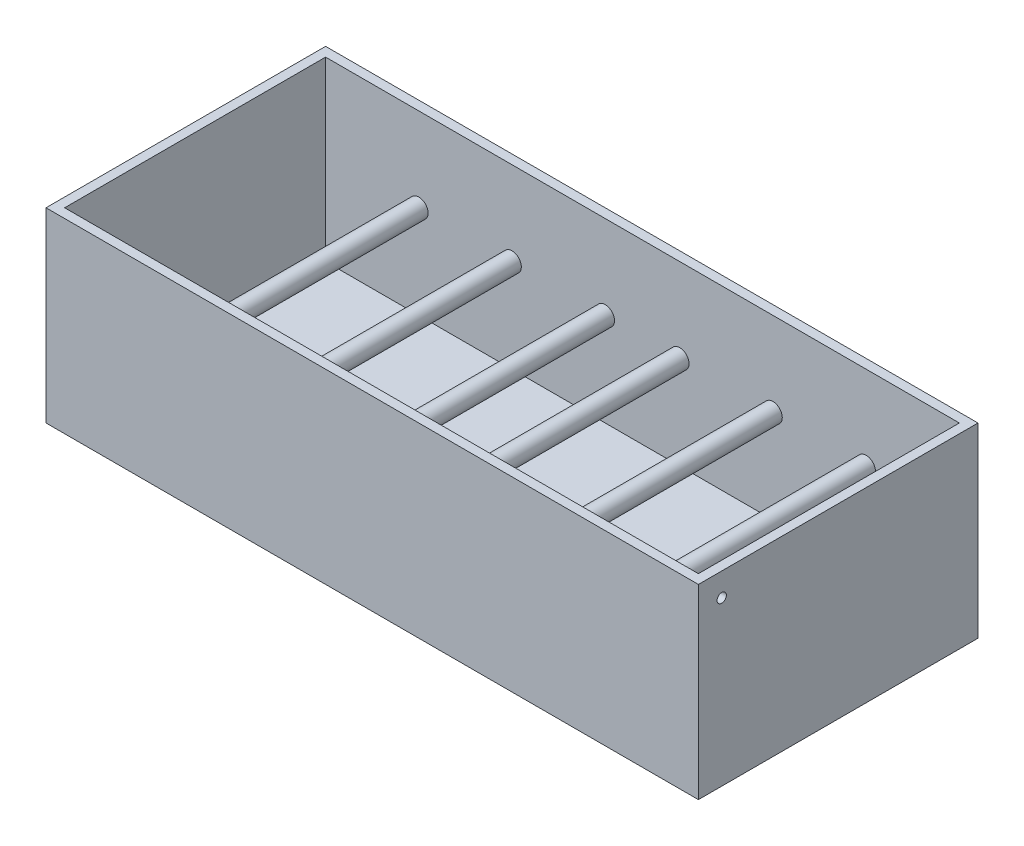
ISO-10303-21;
HEADER;
FILE_DESCRIPTION(('STEP AP214'),'2;1');
FILE_NAME('part.step','',(''),(''),'','','');
FILE_SCHEMA(('AUTOMOTIVE_DESIGN { 1 0 10303 214 1 1 1 1 }'));
ENDSEC;
DATA;
#1=APPLICATION_CONTEXT('core data for automotive mechanical design processes');
#2=APPLICATION_PROTOCOL_DEFINITION('international standard','automotive_design',2000,#1);
#3=PRODUCT_CONTEXT('',#1,'mechanical');
#4=PRODUCT('Part','Part','',(#3));
#5=PRODUCT_RELATED_PRODUCT_CATEGORY('part','',(#4));
#6=PRODUCT_DEFINITION_FORMATION('','',#4);
#7=PRODUCT_DEFINITION_CONTEXT('part definition',#1,'design');
#8=PRODUCT_DEFINITION('design','',#6,#7);
#9=PRODUCT_DEFINITION_SHAPE('','',#8);
#10=(LENGTH_UNIT() NAMED_UNIT(*) SI_UNIT(.MILLI.,.METRE.));
#11=(NAMED_UNIT(*) PLANE_ANGLE_UNIT() SI_UNIT($,.RADIAN.));
#12=(NAMED_UNIT(*) SI_UNIT($,.STERADIAN.) SOLID_ANGLE_UNIT());
#13=UNCERTAINTY_MEASURE_WITH_UNIT(LENGTH_MEASURE(1.E-05),#10,'distance_accuracy_value','');
#14=(GEOMETRIC_REPRESENTATION_CONTEXT(3) GLOBAL_UNCERTAINTY_ASSIGNED_CONTEXT((#13)) GLOBAL_UNIT_ASSIGNED_CONTEXT((#10,
#11,#12)) REPRESENTATION_CONTEXT('',''));
#15=CARTESIAN_POINT('',(0.,0.,0.));
#16=DIRECTION('',(0.,0.,1.));
#17=DIRECTION('',(1.,0.,0.));
#18=AXIS2_PLACEMENT_3D('',#15,#16,#17);
#19=CARTESIAN_POINT('',(-340.,10.,140.));
#20=DIRECTION('',(0.,0.,1.));
#21=DIRECTION('',(1.,0.,0.));
#22=AXIS2_PLACEMENT_3D('',#19,#20,#21);
#23=PLANE('',#22);
#24=CARTESIAN_POINT('',(-240.,110.,140.));
#25=DIRECTION('',(0.,0.,1.));
#26=DIRECTION('',(1.,0.,0.));
#27=AXIS2_PLACEMENT_3D('',#24,#25,#26);
#28=CIRCLE('',#27,10.);
#29=CARTESIAN_POINT('',(-230.,110.,140.));
#30=VERTEX_POINT('',#29);
#31=EDGE_CURVE('E204',#30,#30,#28,.F.);
#32=ORIENTED_EDGE('',*,*,#31,.F.);
#33=EDGE_LOOP('',(#32));
#34=FACE_BOUND('',#33,.T.);
#35=CARTESIAN_POINT('',(40.0000000000001,110.,140.));
#36=DIRECTION('',(0.,0.,1.));
#37=DIRECTION('',(1.,0.,0.));
#38=AXIS2_PLACEMENT_3D('',#35,#36,#37);
#39=CIRCLE('',#38,10.);
#40=CARTESIAN_POINT('',(50.0000000000001,110.,140.));
#41=VERTEX_POINT('',#40);
#42=EDGE_CURVE('E192',#41,#41,#39,.F.);
#43=ORIENTED_EDGE('',*,*,#42,.F.);
#44=EDGE_LOOP('',(#43));
#45=FACE_BOUND('',#44,.T.);
#46=CARTESIAN_POINT('',(240.,110.,140.));
#47=DIRECTION('',(0.,0.,1.));
#48=DIRECTION('',(1.,0.,0.));
#49=AXIS2_PLACEMENT_3D('',#46,#47,#48);
#50=CIRCLE('',#49,10.);
#51=CARTESIAN_POINT('',(250.,110.,140.));
#52=VERTEX_POINT('',#51);
#53=EDGE_CURVE('E180',#52,#52,#50,.F.);
#54=ORIENTED_EDGE('',*,*,#53,.F.);
#55=EDGE_LOOP('',(#54));
#56=FACE_BOUND('',#55,.T.);
#57=DIRECTION('',(1.,0.,0.));
#58=VECTOR('',#57,1.);
#59=CARTESIAN_POINT('',(-340.,200.,140.));
#60=LINE('',#59,#58);
#61=CARTESIAN_POINT('',(-340.,200.,140.));
#62=VERTEX_POINT('',#61);
#63=CARTESIAN_POINT('',(340.,200.,140.));
#64=VERTEX_POINT('',#63);
#65=EDGE_CURVE('E129',#62,#64,#60,.T.);
#66=ORIENTED_EDGE('',*,*,#65,.T.);
#67=DIRECTION('',(0.,1.,0.));
#68=VECTOR('',#67,1.);
#69=CARTESIAN_POINT('',(340.,10.,140.));
#70=LINE('',#69,#68);
#71=CARTESIAN_POINT('',(340.,10.,140.));
#72=VERTEX_POINT('',#71);
#73=EDGE_CURVE('E145',#72,#64,#70,.T.);
#74=ORIENTED_EDGE('',*,*,#73,.F.);
#75=DIRECTION('',(1.,0.,0.));
#76=VECTOR('',#75,1.);
#77=CARTESIAN_POINT('',(-340.,10.,140.));
#78=LINE('',#77,#76);
#79=CARTESIAN_POINT('',(-340.,10.,140.));
#80=VERTEX_POINT('',#79);
#81=EDGE_CURVE('E116',#80,#72,#78,.T.);
#82=ORIENTED_EDGE('',*,*,#81,.F.);
#83=DIRECTION('',(0.,1.,0.));
#84=VECTOR('',#83,1.);
#85=CARTESIAN_POINT('',(-340.,10.,140.));
#86=LINE('',#85,#84);
#87=EDGE_CURVE('E148',#80,#62,#86,.T.);
#88=ORIENTED_EDGE('',*,*,#87,.T.);
#89=EDGE_LOOP('',(#66,#74,#82,#88));
#90=FACE_BOUND('',#89,.T.);
#91=CARTESIAN_POINT('',(140.,110.,140.));
#92=DIRECTION('',(0.,0.,1.));
#93=DIRECTION('',(1.,0.,0.));
#94=AXIS2_PLACEMENT_3D('',#91,#92,#93);
#95=CIRCLE('',#94,10.);
#96=CARTESIAN_POINT('',(150.,110.,140.));
#97=VERTEX_POINT('',#96);
#98=EDGE_CURVE('E186',#97,#97,#95,.F.);
#99=ORIENTED_EDGE('',*,*,#98,.F.);
#100=EDGE_LOOP('',(#99));
#101=FACE_BOUND('',#100,.T.);
#102=CARTESIAN_POINT('',(-140.,110.,140.));
#103=DIRECTION('',(0.,0.,1.));
#104=DIRECTION('',(1.,0.,0.));
#105=AXIS2_PLACEMENT_3D('',#102,#103,#104);
#106=CIRCLE('',#105,10.);
#107=CARTESIAN_POINT('',(-130.,110.,140.));
#108=VERTEX_POINT('',#107);
#109=EDGE_CURVE('E198',#108,#108,#106,.F.);
#110=ORIENTED_EDGE('',*,*,#109,.F.);
#111=EDGE_LOOP('',(#110));
#112=FACE_BOUND('',#111,.T.);
#113=CARTESIAN_POINT('',(-40.,110.,140.));
#114=DIRECTION('',(0.,0.,1.));
#115=DIRECTION('',(1.,0.,0.));
#116=AXIS2_PLACEMENT_3D('',#113,#114,#115);
#117=CIRCLE('',#116,10.);
#118=CARTESIAN_POINT('',(-30.,110.,140.));
#119=VERTEX_POINT('',#118);
#120=EDGE_CURVE('E11',#119,#119,#117,.F.);
#121=ORIENTED_EDGE('',*,*,#120,.F.);
#122=EDGE_LOOP('',(#121));
#123=FACE_BOUND('',#122,.T.);
#124=ADVANCED_FACE('F33',(#34,#45,#56,#90,#101,#112,#123),#23,.F.);
#125=CARTESIAN_POINT('',(-340.,10.,-140.));
#126=DIRECTION('',(0.,0.,-1.));
#127=DIRECTION('',(-1.,0.,0.));
#128=AXIS2_PLACEMENT_3D('',#125,#126,#127);
#129=PLANE('',#128);
#130=CARTESIAN_POINT('',(-240.,110.,-140.));
#131=DIRECTION('',(0.,0.,-1.));
#132=DIRECTION('',(-1.,0.,0.));
#133=AXIS2_PLACEMENT_3D('',#130,#131,#132);
#134=CIRCLE('',#133,10.);
#135=CARTESIAN_POINT('',(-250.,110.,-140.));
#136=VERTEX_POINT('',#135);
#137=EDGE_CURVE('E201',#136,#136,#134,.F.);
#138=ORIENTED_EDGE('',*,*,#137,.F.);
#139=EDGE_LOOP('',(#138));
#140=FACE_BOUND('',#139,.T.);
#141=CARTESIAN_POINT('',(40.0000000000001,110.,-140.));
#142=DIRECTION('',(0.,0.,-1.));
#143=DIRECTION('',(-1.,0.,0.));
#144=AXIS2_PLACEMENT_3D('',#141,#142,#143);
#145=CIRCLE('',#144,10.);
#146=CARTESIAN_POINT('',(30.0000000000001,110.,-140.));
#147=VERTEX_POINT('',#146);
#148=EDGE_CURVE('E189',#147,#147,#145,.F.);
#149=ORIENTED_EDGE('',*,*,#148,.F.);
#150=EDGE_LOOP('',(#149));
#151=FACE_BOUND('',#150,.T.);
#152=CARTESIAN_POINT('',(240.,110.,-140.));
#153=DIRECTION('',(0.,0.,-1.));
#154=DIRECTION('',(-1.,0.,0.));
#155=AXIS2_PLACEMENT_3D('',#152,#153,#154);
#156=CIRCLE('',#155,10.);
#157=CARTESIAN_POINT('',(230.,110.,-140.));
#158=VERTEX_POINT('',#157);
#159=EDGE_CURVE('E173',#158,#158,#156,.F.);
#160=ORIENTED_EDGE('',*,*,#159,.F.);
#161=EDGE_LOOP('',(#160));
#162=FACE_BOUND('',#161,.T.);
#163=DIRECTION('',(-1.,0.,0.));
#164=VECTOR('',#163,1.);
#165=CARTESIAN_POINT('',(-340.,200.,-140.));
#166=LINE('',#165,#164);
#167=CARTESIAN_POINT('',(340.,200.,-140.));
#168=VERTEX_POINT('',#167);
#169=CARTESIAN_POINT('',(-340.,200.,-140.));
#170=VERTEX_POINT('',#169);
#171=EDGE_CURVE('E141',#168,#170,#166,.T.);
#172=ORIENTED_EDGE('',*,*,#171,.T.);
#173=DIRECTION('',(0.,1.,0.));
#174=VECTOR('',#173,1.);
#175=CARTESIAN_POINT('',(-340.,10.,-140.));
#176=LINE('',#175,#174);
#177=CARTESIAN_POINT('',(-340.,10.,-140.));
#178=VERTEX_POINT('',#177);
#179=EDGE_CURVE('E115',#178,#170,#176,.T.);
#180=ORIENTED_EDGE('',*,*,#179,.F.);
#181=DIRECTION('',(-1.,0.,0.));
#182=VECTOR('',#181,1.);
#183=CARTESIAN_POINT('',(-340.,10.,-140.));
#184=LINE('',#183,#182);
#185=CARTESIAN_POINT('',(340.,10.,-140.));
#186=VERTEX_POINT('',#185);
#187=EDGE_CURVE('E119',#186,#178,#184,.T.);
#188=ORIENTED_EDGE('',*,*,#187,.F.);
#189=DIRECTION('',(0.,1.,0.));
#190=VECTOR('',#189,1.);
#191=CARTESIAN_POINT('',(340.,10.,-140.));
#192=LINE('',#191,#190);
#193=EDGE_CURVE('E106',#186,#168,#192,.T.);
#194=ORIENTED_EDGE('',*,*,#193,.T.);
#195=EDGE_LOOP('',(#172,#180,#188,#194));
#196=FACE_BOUND('',#195,.T.);
#197=CARTESIAN_POINT('',(140.,110.,-140.));
#198=DIRECTION('',(0.,0.,-1.));
#199=DIRECTION('',(-1.,0.,0.));
#200=AXIS2_PLACEMENT_3D('',#197,#198,#199);
#201=CIRCLE('',#200,10.);
#202=CARTESIAN_POINT('',(130.,110.,-140.));
#203=VERTEX_POINT('',#202);
#204=EDGE_CURVE('E183',#203,#203,#201,.F.);
#205=ORIENTED_EDGE('',*,*,#204,.F.);
#206=EDGE_LOOP('',(#205));
#207=FACE_BOUND('',#206,.T.);
#208=CARTESIAN_POINT('',(-140.,110.,-140.));
#209=DIRECTION('',(0.,0.,-1.));
#210=DIRECTION('',(-1.,0.,0.));
#211=AXIS2_PLACEMENT_3D('',#208,#209,#210);
#212=CIRCLE('',#211,10.);
#213=CARTESIAN_POINT('',(-150.,110.,-140.));
#214=VERTEX_POINT('',#213);
#215=EDGE_CURVE('E195',#214,#214,#212,.F.);
#216=ORIENTED_EDGE('',*,*,#215,.F.);
#217=EDGE_LOOP('',(#216));
#218=FACE_BOUND('',#217,.T.);
#219=CARTESIAN_POINT('',(-40.,110.,-140.));
#220=DIRECTION('',(0.,0.,-1.));
#221=DIRECTION('',(-1.,0.,0.));
#222=AXIS2_PLACEMENT_3D('',#219,#220,#221);
#223=CIRCLE('',#222,10.);
#224=CARTESIAN_POINT('',(-50.,110.,-140.));
#225=VERTEX_POINT('',#224);
#226=EDGE_CURVE('E41',#225,#225,#223,.F.);
#227=ORIENTED_EDGE('',*,*,#226,.F.);
#228=EDGE_LOOP('',(#227));
#229=FACE_BOUND('',#228,.T.);
#230=ADVANCED_FACE('F120',(#140,#151,#162,#196,#207,#218,#229),#129,.F.);
#231=CARTESIAN_POINT('',(350.,200.,150.));
#232=DIRECTION('',(-1.,0.,0.));
#233=DIRECTION('',(0.,0.,1.));
#234=AXIS2_PLACEMENT_3D('',#231,#232,#233);
#235=PLANE('',#234);
#236=CARTESIAN_POINT('',(350.,175.,125.));
#237=DIRECTION('',(1.,0.,0.));
#238=DIRECTION('',(0.,0.,-1.));
#239=AXIS2_PLACEMENT_3D('',#236,#237,#238);
#240=CIRCLE('',#239,4.99999999999999);
#241=CARTESIAN_POINT('',(350.,175.,120.));
#242=VERTEX_POINT('',#241);
#243=EDGE_CURVE('E428',#242,#242,#240,.T.);
#244=ORIENTED_EDGE('',*,*,#243,.F.);
#245=EDGE_LOOP('',(#244));
#246=FACE_BOUND('',#245,.T.);
#247=DIRECTION('',(0.,0.,-1.));
#248=VECTOR('',#247,1.);
#249=CARTESIAN_POINT('',(350.,0.,150.));
#250=LINE('',#249,#248);
#251=CARTESIAN_POINT('',(350.,0.,150.));
#252=VERTEX_POINT('',#251);
#253=CARTESIAN_POINT('',(350.,0.,-150.));
#254=VERTEX_POINT('',#253);
#255=EDGE_CURVE('E147',#252,#254,#250,.T.);
#256=ORIENTED_EDGE('',*,*,#255,.T.);
#257=DIRECTION('',(0.,-1.,0.));
#258=VECTOR('',#257,1.);
#259=CARTESIAN_POINT('',(350.,200.,-150.));
#260=LINE('',#259,#258);
#261=CARTESIAN_POINT('',(350.,200.,-150.));
#262=VERTEX_POINT('',#261);
#263=EDGE_CURVE('E171',#262,#254,#260,.T.);
#264=ORIENTED_EDGE('',*,*,#263,.F.);
#265=DIRECTION('',(0.,0.,-1.));
#266=VECTOR('',#265,1.);
#267=CARTESIAN_POINT('',(350.,200.,150.));
#268=LINE('',#267,#266);
#269=CARTESIAN_POINT('',(350.,200.,150.));
#270=VERTEX_POINT('',#269);
#271=EDGE_CURVE('E151',#270,#262,#268,.T.);
#272=ORIENTED_EDGE('',*,*,#271,.F.);
#273=DIRECTION('',(0.,-1.,0.));
#274=VECTOR('',#273,1.);
#275=CARTESIAN_POINT('',(350.,200.,150.));
#276=LINE('',#275,#274);
#277=EDGE_CURVE('E157',#270,#252,#276,.T.);
#278=ORIENTED_EDGE('',*,*,#277,.T.);
#279=EDGE_LOOP('',(#256,#264,#272,#278));
#280=FACE_BOUND('',#279,.T.);
#281=ADVANCED_FACE('F35',(#246,#280),#235,.F.);
#282=CARTESIAN_POINT('',(-350.,200.,-150.));
#283=DIRECTION('',(0.,0.,1.));
#284=DIRECTION('',(1.,0.,0.));
#285=AXIS2_PLACEMENT_3D('',#282,#283,#284);
#286=PLANE('',#285);
#287=DIRECTION('',(-1.,0.,0.));
#288=VECTOR('',#287,1.);
#289=CARTESIAN_POINT('',(-350.,0.,-150.));
#290=LINE('',#289,#288);
#291=CARTESIAN_POINT('',(-350.,0.,-150.));
#292=VERTEX_POINT('',#291);
#293=EDGE_CURVE('E160',#254,#292,#290,.T.);
#294=ORIENTED_EDGE('',*,*,#293,.T.);
#295=DIRECTION('',(0.,-1.,0.));
#296=VECTOR('',#295,1.);
#297=CARTESIAN_POINT('',(-350.,200.,-150.));
#298=LINE('',#297,#296);
#299=CARTESIAN_POINT('',(-350.,200.,-150.));
#300=VERTEX_POINT('',#299);
#301=EDGE_CURVE('E168',#300,#292,#298,.T.);
#302=ORIENTED_EDGE('',*,*,#301,.F.);
#303=DIRECTION('',(-1.,0.,0.));
#304=VECTOR('',#303,1.);
#305=CARTESIAN_POINT('',(-350.,200.,-150.));
#306=LINE('',#305,#304);
#307=EDGE_CURVE('E86',#262,#300,#306,.T.);
#308=ORIENTED_EDGE('',*,*,#307,.F.);
#309=ORIENTED_EDGE('',*,*,#263,.T.);
#310=EDGE_LOOP('',(#294,#302,#308,#309));
#311=FACE_BOUND('',#310,.T.);
#312=ADVANCED_FACE('F218',(#311),#286,.F.);
#313=CARTESIAN_POINT('',(-350.,200.,150.));
#314=DIRECTION('',(1.,0.,0.));
#315=DIRECTION('',(0.,0.,-1.));
#316=AXIS2_PLACEMENT_3D('',#313,#314,#315);
#317=PLANE('',#316);
#318=CARTESIAN_POINT('',(-350.,175.,125.));
#319=DIRECTION('',(1.,0.,0.));
#320=DIRECTION('',(0.,0.,-1.));
#321=AXIS2_PLACEMENT_3D('',#318,#319,#320);
#322=CIRCLE('',#321,4.99999999999999);
#323=CARTESIAN_POINT('',(-350.,175.,120.));
#324=VERTEX_POINT('',#323);
#325=EDGE_CURVE('E177',#324,#324,#322,.T.);
#326=ORIENTED_EDGE('',*,*,#325,.T.);
#327=EDGE_LOOP('',(#326));
#328=FACE_BOUND('',#327,.T.);
#329=DIRECTION('',(0.,0.,1.));
#330=VECTOR('',#329,1.);
#331=CARTESIAN_POINT('',(-350.,0.,150.));
#332=LINE('',#331,#330);
#333=CARTESIAN_POINT('',(-350.,0.,150.));
#334=VERTEX_POINT('',#333);
#335=EDGE_CURVE('E162',#292,#334,#332,.T.);
#336=ORIENTED_EDGE('',*,*,#335,.T.);
#337=DIRECTION('',(0.,-1.,0.));
#338=VECTOR('',#337,1.);
#339=CARTESIAN_POINT('',(-350.,200.,150.));
#340=LINE('',#339,#338);
#341=CARTESIAN_POINT('',(-350.,200.,150.));
#342=VERTEX_POINT('',#341);
#343=EDGE_CURVE('E166',#342,#334,#340,.T.);
#344=ORIENTED_EDGE('',*,*,#343,.F.);
#345=DIRECTION('',(0.,0.,1.));
#346=VECTOR('',#345,1.);
#347=CARTESIAN_POINT('',(-350.,200.,150.));
#348=LINE('',#347,#346);
#349=EDGE_CURVE('E154',#300,#342,#348,.T.);
#350=ORIENTED_EDGE('',*,*,#349,.F.);
#351=ORIENTED_EDGE('',*,*,#301,.T.);
#352=EDGE_LOOP('',(#336,#344,#350,#351));
#353=FACE_BOUND('',#352,.T.);
#354=ADVANCED_FACE('F241',(#328,#353),#317,.F.);
#355=CARTESIAN_POINT('',(-350.,200.,150.));
#356=DIRECTION('',(0.,0.,-1.));
#357=DIRECTION('',(-1.,0.,0.));
#358=AXIS2_PLACEMENT_3D('',#355,#356,#357);
#359=PLANE('',#358);
#360=DIRECTION('',(1.,0.,0.));
#361=VECTOR('',#360,1.);
#362=CARTESIAN_POINT('',(-350.,0.,150.));
#363=LINE('',#362,#361);
#364=EDGE_CURVE('E78',#334,#252,#363,.T.);
#365=ORIENTED_EDGE('',*,*,#364,.T.);
#366=ORIENTED_EDGE('',*,*,#277,.F.);
#367=DIRECTION('',(1.,0.,0.));
#368=VECTOR('',#367,1.);
#369=CARTESIAN_POINT('',(-350.,200.,150.));
#370=LINE('',#369,#368);
#371=EDGE_CURVE('E57',#342,#270,#370,.T.);
#372=ORIENTED_EDGE('',*,*,#371,.F.);
#373=ORIENTED_EDGE('',*,*,#343,.T.);
#374=EDGE_LOOP('',(#365,#366,#372,#373));
#375=FACE_BOUND('',#374,.T.);
#376=ADVANCED_FACE('F234',(#375),#359,.F.);
#377=CARTESIAN_POINT('',(0.,200.,0.));
#378=DIRECTION('',(0.,-1.,0.));
#379=DIRECTION('',(0.,0.,-1.));
#380=AXIS2_PLACEMENT_3D('',#377,#378,#379);
#381=PLANE('',#380);
#382=ORIENTED_EDGE('',*,*,#171,.F.);
#383=DIRECTION('',(0.,0.,-1.));
#384=VECTOR('',#383,1.);
#385=CARTESIAN_POINT('',(340.,200.,140.));
#386=LINE('',#385,#384);
#387=EDGE_CURVE('E48',#64,#168,#386,.T.);
#388=ORIENTED_EDGE('',*,*,#387,.F.);
#389=ORIENTED_EDGE('',*,*,#65,.F.);
#390=DIRECTION('',(0.,0.,1.));
#391=VECTOR('',#390,1.);
#392=CARTESIAN_POINT('',(-340.,200.,140.));
#393=LINE('',#392,#391);
#394=EDGE_CURVE('E132',#170,#62,#393,.T.);
#395=ORIENTED_EDGE('',*,*,#394,.F.);
#396=EDGE_LOOP('',(#382,#388,#389,#395));
#397=FACE_BOUND('',#396,.T.);
#398=ORIENTED_EDGE('',*,*,#271,.T.);
#399=ORIENTED_EDGE('',*,*,#307,.T.);
#400=ORIENTED_EDGE('',*,*,#349,.T.);
#401=ORIENTED_EDGE('',*,*,#371,.T.);
#402=EDGE_LOOP('',(#398,#399,#400,#401));
#403=FACE_BOUND('',#402,.T.);
#404=ADVANCED_FACE('F231',(#397,#403),#381,.F.);
#405=CARTESIAN_POINT('',(0.,0.,0.));
#406=DIRECTION('',(0.,-1.,0.));
#407=DIRECTION('',(0.,0.,-1.));
#408=AXIS2_PLACEMENT_3D('',#405,#406,#407);
#409=PLANE('',#408);
#410=ORIENTED_EDGE('',*,*,#255,.F.);
#411=ORIENTED_EDGE('',*,*,#364,.F.);
#412=ORIENTED_EDGE('',*,*,#335,.F.);
#413=ORIENTED_EDGE('',*,*,#293,.F.);
#414=EDGE_LOOP('',(#410,#411,#412,#413));
#415=FACE_BOUND('',#414,.T.);
#416=ADVANCED_FACE('F229',(#415),#409,.T.);
#417=CARTESIAN_POINT('',(340.,10.,140.));
#418=DIRECTION('',(1.,0.,0.));
#419=DIRECTION('',(0.,0.,-1.));
#420=AXIS2_PLACEMENT_3D('',#417,#418,#419);
#421=PLANE('',#420);
#422=CARTESIAN_POINT('',(340.,175.,125.));
#423=DIRECTION('',(1.,0.,0.));
#424=DIRECTION('',(0.,0.,-1.));
#425=AXIS2_PLACEMENT_3D('',#422,#423,#424);
#426=CIRCLE('',#425,4.99999999999999);
#427=CARTESIAN_POINT('',(340.,175.,120.));
#428=VERTEX_POINT('',#427);
#429=EDGE_CURVE('E135',#428,#428,#426,.T.);
#430=ORIENTED_EDGE('',*,*,#429,.T.);
#431=EDGE_LOOP('',(#430));
#432=FACE_BOUND('',#431,.T.);
#433=ORIENTED_EDGE('',*,*,#387,.T.);
#434=ORIENTED_EDGE('',*,*,#193,.F.);
#435=DIRECTION('',(0.,0.,-1.));
#436=VECTOR('',#435,1.);
#437=CARTESIAN_POINT('',(340.,10.,140.));
#438=LINE('',#437,#436);
#439=EDGE_CURVE('E110',#72,#186,#438,.T.);
#440=ORIENTED_EDGE('',*,*,#439,.F.);
#441=ORIENTED_EDGE('',*,*,#73,.T.);
#442=EDGE_LOOP('',(#433,#434,#440,#441));
#443=FACE_BOUND('',#442,.T.);
#444=ADVANCED_FACE('F108',(#432,#443),#421,.F.);
#445=CARTESIAN_POINT('',(-340.,10.,140.));
#446=DIRECTION('',(-1.,0.,0.));
#447=DIRECTION('',(0.,0.,1.));
#448=AXIS2_PLACEMENT_3D('',#445,#446,#447);
#449=PLANE('',#448);
#450=CARTESIAN_POINT('',(-340.,175.,125.));
#451=DIRECTION('',(-1.,0.,0.));
#452=DIRECTION('',(0.,0.,1.));
#453=AXIS2_PLACEMENT_3D('',#450,#451,#452);
#454=CIRCLE('',#453,4.99999999999999);
#455=CARTESIAN_POINT('',(-340.,175.,130.));
#456=VERTEX_POINT('',#455);
#457=EDGE_CURVE('E174',#456,#456,#454,.T.);
#458=ORIENTED_EDGE('',*,*,#457,.T.);
#459=EDGE_LOOP('',(#458));
#460=FACE_BOUND('',#459,.T.);
#461=ORIENTED_EDGE('',*,*,#394,.T.);
#462=ORIENTED_EDGE('',*,*,#87,.F.);
#463=DIRECTION('',(0.,0.,1.));
#464=VECTOR('',#463,1.);
#465=CARTESIAN_POINT('',(-340.,10.,140.));
#466=LINE('',#465,#464);
#467=EDGE_CURVE('E125',#178,#80,#466,.T.);
#468=ORIENTED_EDGE('',*,*,#467,.F.);
#469=ORIENTED_EDGE('',*,*,#179,.T.);
#470=EDGE_LOOP('',(#461,#462,#468,#469));
#471=FACE_BOUND('',#470,.T.);
#472=ADVANCED_FACE('F226',(#460,#471),#449,.F.);
#473=CARTESIAN_POINT('',(0.,10.,0.));
#474=DIRECTION('',(0.,-1.,0.));
#475=DIRECTION('',(0.,0.,-1.));
#476=AXIS2_PLACEMENT_3D('',#473,#474,#475);
#477=PLANE('',#476);
#478=ORIENTED_EDGE('',*,*,#439,.T.);
#479=ORIENTED_EDGE('',*,*,#187,.T.);
#480=ORIENTED_EDGE('',*,*,#467,.T.);
#481=ORIENTED_EDGE('',*,*,#81,.T.);
#482=EDGE_LOOP('',(#478,#479,#480,#481));
#483=FACE_BOUND('',#482,.T.);
#484=ADVANCED_FACE('F127',(#483),#477,.F.);
#485=CARTESIAN_POINT('',(-350.,175.,125.));
#486=DIRECTION('',(1.,0.,0.));
#487=DIRECTION('',(0.,0.,-1.));
#488=AXIS2_PLACEMENT_3D('',#485,#486,#487);
#489=CYLINDRICAL_SURFACE('',#488,4.99999999999999);
#490=ORIENTED_EDGE('',*,*,#325,.F.);
#491=EDGE_LOOP('',(#490));
#492=FACE_BOUND('',#491,.T.);
#493=ORIENTED_EDGE('',*,*,#457,.F.);
#494=EDGE_LOOP('',(#493));
#495=FACE_BOUND('',#494,.T.);
#496=ADVANCED_FACE('F290',(#492,#495),#489,.F.);
#497=ORIENTED_EDGE('',*,*,#243,.T.);
#498=EDGE_LOOP('',(#497));
#499=FACE_BOUND('',#498,.T.);
#500=ORIENTED_EDGE('',*,*,#429,.F.);
#501=EDGE_LOOP('',(#500));
#502=FACE_BOUND('',#501,.T.);
#503=ADVANCED_FACE('F296',(#499,#502),#489,.F.);
#504=CARTESIAN_POINT('',(240.,110.,-168.284271247462));
#505=DIRECTION('',(0.,0.,1.));
#506=DIRECTION('',(1.,0.,0.));
#507=AXIS2_PLACEMENT_3D('',#504,#505,#506);
#508=CYLINDRICAL_SURFACE('',#507,10.);
#509=ORIENTED_EDGE('',*,*,#53,.T.);
#510=EDGE_LOOP('',(#509));
#511=FACE_BOUND('',#510,.T.);
#512=ORIENTED_EDGE('',*,*,#159,.T.);
#513=EDGE_LOOP('',(#512));
#514=FACE_BOUND('',#513,.T.);
#515=ADVANCED_FACE('F304',(#511,#514),#508,.T.);
#516=CARTESIAN_POINT('',(140.,110.,-168.284271247462));
#517=DIRECTION('',(0.,0.,1.));
#518=DIRECTION('',(1.,0.,0.));
#519=AXIS2_PLACEMENT_3D('',#516,#517,#518);
#520=CYLINDRICAL_SURFACE('',#519,10.);
#521=ORIENTED_EDGE('',*,*,#98,.T.);
#522=EDGE_LOOP('',(#521));
#523=FACE_BOUND('',#522,.T.);
#524=ORIENTED_EDGE('',*,*,#204,.T.);
#525=EDGE_LOOP('',(#524));
#526=FACE_BOUND('',#525,.T.);
#527=ADVANCED_FACE('F312',(#523,#526),#520,.T.);
#528=CARTESIAN_POINT('',(40.0000000000001,110.,-168.284271247462));
#529=DIRECTION('',(0.,0.,1.));
#530=DIRECTION('',(1.,0.,0.));
#531=AXIS2_PLACEMENT_3D('',#528,#529,#530);
#532=CYLINDRICAL_SURFACE('',#531,10.);
#533=ORIENTED_EDGE('',*,*,#42,.T.);
#534=EDGE_LOOP('',(#533));
#535=FACE_BOUND('',#534,.T.);
#536=ORIENTED_EDGE('',*,*,#148,.T.);
#537=EDGE_LOOP('',(#536));
#538=FACE_BOUND('',#537,.T.);
#539=ADVANCED_FACE('F320',(#535,#538),#532,.T.);
#540=CARTESIAN_POINT('',(-140.,110.,-168.284271247462));
#541=DIRECTION('',(0.,0.,1.));
#542=DIRECTION('',(1.,0.,0.));
#543=AXIS2_PLACEMENT_3D('',#540,#541,#542);
#544=CYLINDRICAL_SURFACE('',#543,10.);
#545=ORIENTED_EDGE('',*,*,#109,.T.);
#546=EDGE_LOOP('',(#545));
#547=FACE_BOUND('',#546,.T.);
#548=ORIENTED_EDGE('',*,*,#215,.T.);
#549=EDGE_LOOP('',(#548));
#550=FACE_BOUND('',#549,.T.);
#551=ADVANCED_FACE('F328',(#547,#550),#544,.T.);
#552=CARTESIAN_POINT('',(-240.,110.,-168.284271247462));
#553=DIRECTION('',(0.,0.,1.));
#554=DIRECTION('',(1.,0.,0.));
#555=AXIS2_PLACEMENT_3D('',#552,#553,#554);
#556=CYLINDRICAL_SURFACE('',#555,10.);
#557=ORIENTED_EDGE('',*,*,#31,.T.);
#558=EDGE_LOOP('',(#557));
#559=FACE_BOUND('',#558,.T.);
#560=ORIENTED_EDGE('',*,*,#137,.T.);
#561=EDGE_LOOP('',(#560));
#562=FACE_BOUND('',#561,.T.);
#563=ADVANCED_FACE('F336',(#559,#562),#556,.T.);
#564=CARTESIAN_POINT('',(-40.,110.,-168.284271247462));
#565=DIRECTION('',(0.,0.,1.));
#566=DIRECTION('',(1.,0.,0.));
#567=AXIS2_PLACEMENT_3D('',#564,#565,#566);
#568=CYLINDRICAL_SURFACE('',#567,10.);
#569=ORIENTED_EDGE('',*,*,#120,.T.);
#570=EDGE_LOOP('',(#569));
#571=FACE_BOUND('',#570,.T.);
#572=ORIENTED_EDGE('',*,*,#226,.T.);
#573=EDGE_LOOP('',(#572));
#574=FACE_BOUND('',#573,.T.);
#575=ADVANCED_FACE('F209',(#571,#574),#568,.T.);
#576=CLOSED_SHELL('',(#124,#230,#281,#312,#354,#376,#404,#416,#444,#472,#484,#496,#503,#515,
#527,#539,#551,#563,#575));
#577=MANIFOLD_SOLID_BREP('B2',#576);
#578=ADVANCED_BREP_SHAPE_REPRESENTATION('',(#18,#577),#14);
#579=SHAPE_DEFINITION_REPRESENTATION(#9,#578);
ENDSEC;
END-ISO-10303-21;
